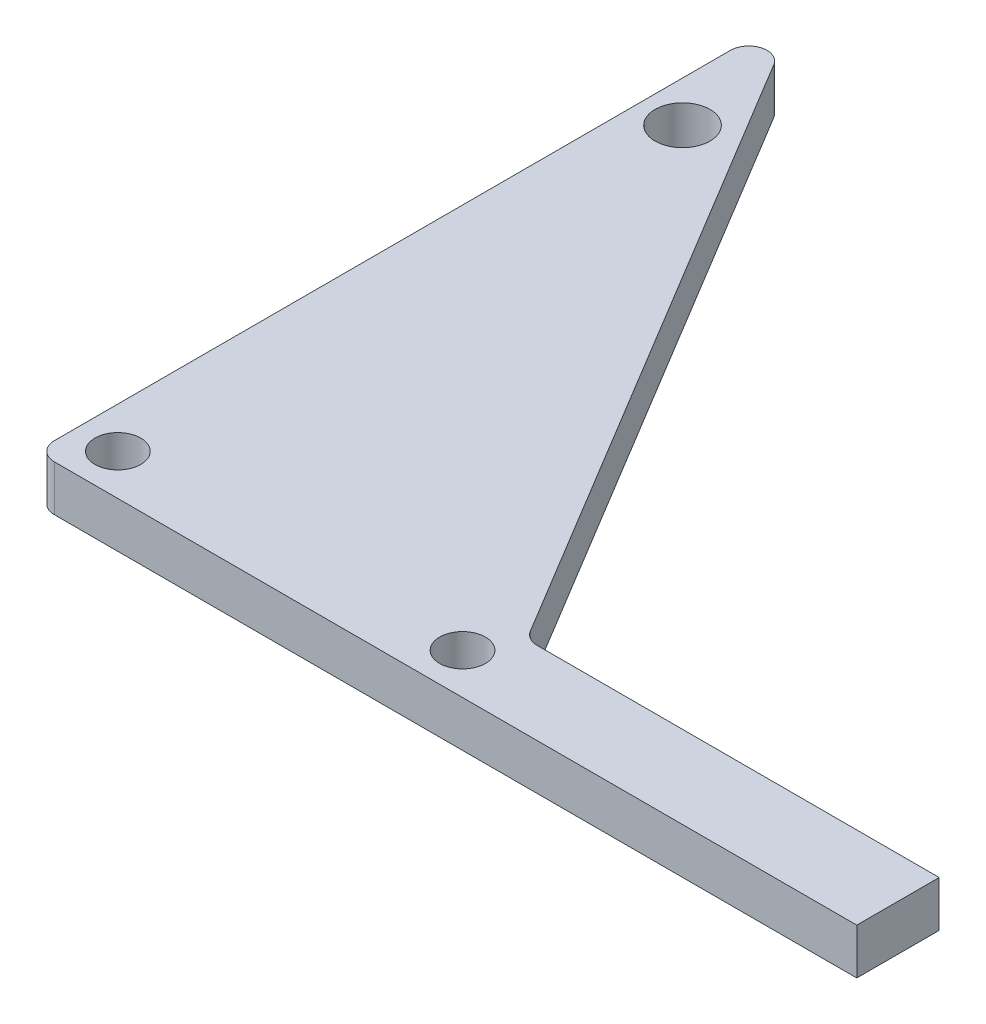
ISO-10303-21;
HEADER;
FILE_DESCRIPTION(('STEP AP214'),'2;1');
FILE_NAME('part.step','',(''),(''),'','','');
FILE_SCHEMA(('AUTOMOTIVE_DESIGN { 1 0 10303 214 1 1 1 1 }'));
ENDSEC;
DATA;
#1=APPLICATION_CONTEXT('core data for automotive mechanical design processes');
#2=APPLICATION_PROTOCOL_DEFINITION('international standard','automotive_design',2000,#1);
#3=PRODUCT_CONTEXT('',#1,'mechanical');
#4=PRODUCT('Part','Part','',(#3));
#5=PRODUCT_RELATED_PRODUCT_CATEGORY('part','',(#4));
#6=PRODUCT_DEFINITION_FORMATION('','',#4);
#7=PRODUCT_DEFINITION_CONTEXT('part definition',#1,'design');
#8=PRODUCT_DEFINITION('design','',#6,#7);
#9=PRODUCT_DEFINITION_SHAPE('','',#8);
#10=(LENGTH_UNIT() NAMED_UNIT(*) SI_UNIT(.MILLI.,.METRE.));
#11=(NAMED_UNIT(*) PLANE_ANGLE_UNIT() SI_UNIT($,.RADIAN.));
#12=(NAMED_UNIT(*) SI_UNIT($,.STERADIAN.) SOLID_ANGLE_UNIT());
#13=UNCERTAINTY_MEASURE_WITH_UNIT(LENGTH_MEASURE(1.E-05),#10,'distance_accuracy_value','');
#14=(GEOMETRIC_REPRESENTATION_CONTEXT(3) GLOBAL_UNCERTAINTY_ASSIGNED_CONTEXT((#13)) GLOBAL_UNIT_ASSIGNED_CONTEXT((#10,
#11,#12)) REPRESENTATION_CONTEXT('',''));
#15=CARTESIAN_POINT('',(0.,0.,0.));
#16=DIRECTION('',(0.,0.,1.));
#17=DIRECTION('',(1.,0.,0.));
#18=AXIS2_PLACEMENT_3D('',#15,#16,#17);
#19=CARTESIAN_POINT('',(0.,6.35,-105.41));
#20=DIRECTION('',(-0.856580972099991,0.,0.516012633795175));
#21=DIRECTION('',(0.516012633795176,0.,0.856580972099991));
#22=AXIS2_PLACEMENT_3D('',#19,#20,#21);
#23=PLANE('',#22);
#24=DIRECTION('',(-0.516012633795176,0.,-0.856580972099991));
#25=VECTOR('',#24,1.);
#26=CARTESIAN_POINT('',(0.,6.35,-105.41));
#27=LINE('',#26,#25);
#28=CARTESIAN_POINT('',(55.8738988493011,6.35,-12.6593279101602));
#29=VERTEX_POINT('',#28);
#30=CARTESIAN_POINT('',(4.71571566913398,6.35,-97.5819119892376));
#31=VERTEX_POINT('',#30);
#32=EDGE_CURVE('E148',#29,#31,#27,.T.);
#33=ORIENTED_EDGE('',*,*,#32,.F.);
#34=DIRECTION('',(0.,-1.,0.));
#35=VECTOR('',#34,1.);
#36=CARTESIAN_POINT('',(55.873898849301,0.,-12.6593279101603));
#37=LINE('',#36,#35);
#38=CARTESIAN_POINT('',(55.8738988493011,0.,-12.6593279101602));
#39=VERTEX_POINT('',#38);
#40=EDGE_CURVE('E175',#29,#39,#37,.T.);
#41=ORIENTED_EDGE('',*,*,#40,.T.);
#42=DIRECTION('',(-0.516012633795176,0.,-0.856580972099991));
#43=VECTOR('',#42,1.);
#44=CARTESIAN_POINT('',(0.,0.,-105.41));
#45=LINE('',#44,#43);
#46=CARTESIAN_POINT('',(4.71571566913398,0.,-97.5819119892376));
#47=VERTEX_POINT('',#46);
#48=EDGE_CURVE('E107',#39,#47,#45,.T.);
#49=ORIENTED_EDGE('',*,*,#48,.T.);
#50=DIRECTION('',(0.,-1.,0.));
#51=VECTOR('',#50,1.);
#52=CARTESIAN_POINT('',(4.71571566913398,6.35,-97.5819119892376));
#53=LINE('',#52,#51);
#54=EDGE_CURVE('E172',#47,#31,#53,.F.);
#55=ORIENTED_EDGE('',*,*,#54,.T.);
#56=EDGE_LOOP('',(#33,#41,#49,#55));
#57=FACE_BOUND('',#56,.T.);
#58=ADVANCED_FACE('F33',(#57),#23,.F.);
#59=CARTESIAN_POINT('',(63.5,6.35,0.));
#60=DIRECTION('',(0.,0.,-1.));
#61=DIRECTION('',(-1.,0.,0.));
#62=AXIS2_PLACEMENT_3D('',#59,#60,#61);
#63=PLANE('',#62);
#64=DIRECTION('',(0.,-1.,0.));
#65=VECTOR('',#64,1.);
#66=CARTESIAN_POINT('',(113.792,6.35,0.));
#67=LINE('',#66,#65);
#68=CARTESIAN_POINT('',(113.792,6.35,0.));
#69=VERTEX_POINT('',#68);
#70=CARTESIAN_POINT('',(113.792,0.,0.));
#71=VERTEX_POINT('',#70);
#72=EDGE_CURVE('E104',#69,#71,#67,.T.);
#73=ORIENTED_EDGE('',*,*,#72,.F.);
#74=DIRECTION('',(1.,0.,0.));
#75=VECTOR('',#74,1.);
#76=CARTESIAN_POINT('',(63.5,6.35,0.));
#77=LINE('',#76,#75);
#78=CARTESIAN_POINT('',(2.54,6.35,0.));
#79=VERTEX_POINT('',#78);
#80=EDGE_CURVE('E146',#79,#69,#77,.T.);
#81=ORIENTED_EDGE('',*,*,#80,.F.);
#82=DIRECTION('',(0.,-1.,0.));
#83=VECTOR('',#82,1.);
#84=CARTESIAN_POINT('',(2.54,6.35,0.));
#85=LINE('',#84,#83);
#86=CARTESIAN_POINT('',(2.54,0.,0.));
#87=VERTEX_POINT('',#86);
#88=EDGE_CURVE('E106',#79,#87,#85,.T.);
#89=ORIENTED_EDGE('',*,*,#88,.T.);
#90=DIRECTION('',(1.,0.,0.));
#91=VECTOR('',#90,1.);
#92=CARTESIAN_POINT('',(63.5,0.,0.));
#93=LINE('',#92,#91);
#94=EDGE_CURVE('E99',#87,#71,#93,.T.);
#95=ORIENTED_EDGE('',*,*,#94,.T.);
#96=EDGE_LOOP('',(#73,#81,#89,#95));
#97=FACE_BOUND('',#96,.T.);
#98=ADVANCED_FACE('F101',(#97),#63,.F.);
#99=CARTESIAN_POINT('',(0.,6.35,0.));
#100=DIRECTION('',(1.,0.,0.));
#101=DIRECTION('',(0.,0.,-1.));
#102=AXIS2_PLACEMENT_3D('',#99,#100,#101);
#103=PLANE('',#102);
#104=DIRECTION('',(0.,0.,1.));
#105=VECTOR('',#104,1.);
#106=CARTESIAN_POINT('',(0.,0.,0.));
#107=LINE('',#106,#105);
#108=CARTESIAN_POINT('',(0.,0.,-96.2712398993978));
#109=VERTEX_POINT('',#108);
#110=CARTESIAN_POINT('',(0.,0.,-2.54));
#111=VERTEX_POINT('',#110);
#112=EDGE_CURVE('E149',#109,#111,#107,.T.);
#113=ORIENTED_EDGE('',*,*,#112,.T.);
#114=DIRECTION('',(0.,-1.,0.));
#115=VECTOR('',#114,1.);
#116=CARTESIAN_POINT('',(0.,6.35,-2.54));
#117=LINE('',#116,#115);
#118=CARTESIAN_POINT('',(0.,6.35,-2.54));
#119=VERTEX_POINT('',#118);
#120=EDGE_CURVE('E166',#111,#119,#117,.F.);
#121=ORIENTED_EDGE('',*,*,#120,.T.);
#122=DIRECTION('',(0.,0.,1.));
#123=VECTOR('',#122,1.);
#124=CARTESIAN_POINT('',(0.,6.35,0.));
#125=LINE('',#124,#123);
#126=CARTESIAN_POINT('',(0.,6.35,-96.2712398993978));
#127=VERTEX_POINT('',#126);
#128=EDGE_CURVE('E151',#127,#119,#125,.T.);
#129=ORIENTED_EDGE('',*,*,#128,.F.);
#130=DIRECTION('',(0.,-1.,0.));
#131=VECTOR('',#130,1.);
#132=CARTESIAN_POINT('',(0.,6.35,-96.2712398993978));
#133=LINE('',#132,#131);
#134=EDGE_CURVE('E163',#127,#109,#133,.T.);
#135=ORIENTED_EDGE('',*,*,#134,.T.);
#136=EDGE_LOOP('',(#113,#121,#129,#135));
#137=FACE_BOUND('',#136,.T.);
#138=ADVANCED_FACE('F195',(#137),#103,.F.);
#139=CARTESIAN_POINT('',(0.,6.35,0.));
#140=DIRECTION('',(0.,-1.,0.));
#141=DIRECTION('',(0.,0.,-1.));
#142=AXIS2_PLACEMENT_3D('',#139,#140,#141);
#143=PLANE('',#142);
#144=DIRECTION('',(-1.,0.,0.));
#145=VECTOR('',#144,1.);
#146=CARTESIAN_POINT('',(113.792,6.35,-11.43));
#147=LINE('',#146,#145);
#148=CARTESIAN_POINT('',(113.792,6.35,-11.43));
#149=VERTEX_POINT('',#148);
#150=CARTESIAN_POINT('',(58.049614518435,6.35,-11.43));
#151=VERTEX_POINT('',#150);
#152=EDGE_CURVE('E126',#149,#151,#147,.T.);
#153=ORIENTED_EDGE('',*,*,#152,.T.);
#154=CARTESIAN_POINT('',(58.049614518435,6.35,-13.97));
#155=DIRECTION('',(0.,-1.,0.));
#156=DIRECTION('',(0.,0.,-1.));
#157=AXIS2_PLACEMENT_3D('',#154,#155,#156);
#158=CIRCLE('',#157,2.54);
#159=EDGE_CURVE('E11',#151,#29,#158,.T.);
#160=ORIENTED_EDGE('',*,*,#159,.T.);
#161=ORIENTED_EDGE('',*,*,#32,.T.);
#162=CARTESIAN_POINT('',(2.54,6.35,-96.2712398993978));
#163=DIRECTION('',(0.,-1.,0.));
#164=DIRECTION('',(0.,0.,-1.));
#165=AXIS2_PLACEMENT_3D('',#162,#163,#164);
#166=CIRCLE('',#165,2.54);
#167=EDGE_CURVE('E168',#31,#127,#166,.F.);
#168=ORIENTED_EDGE('',*,*,#167,.T.);
#169=ORIENTED_EDGE('',*,*,#128,.T.);
#170=CARTESIAN_POINT('',(2.54,6.35,-2.54));
#171=DIRECTION('',(0.,-1.,0.));
#172=DIRECTION('',(0.,0.,-1.));
#173=AXIS2_PLACEMENT_3D('',#170,#171,#172);
#174=CIRCLE('',#173,2.54);
#175=EDGE_CURVE('E170',#119,#79,#174,.F.);
#176=ORIENTED_EDGE('',*,*,#175,.T.);
#177=ORIENTED_EDGE('',*,*,#80,.T.);
#178=DIRECTION('',(0.,0.,1.));
#179=VECTOR('',#178,1.);
#180=CARTESIAN_POINT('',(113.792,6.35,0.));
#181=LINE('',#180,#179);
#182=EDGE_CURVE('E121',#149,#69,#181,.T.);
#183=ORIENTED_EDGE('',*,*,#182,.F.);
#184=EDGE_LOOP('',(#153,#160,#161,#168,#169,#176,#177,#183));
#185=FACE_BOUND('',#184,.T.);
#186=CARTESIAN_POINT('',(53.4606872138509,6.35,-5.67299462965267));
#187=DIRECTION('',(0.,1.,0.));
#188=DIRECTION('',(0.,0.,1.));
#189=AXIS2_PLACEMENT_3D('',#186,#187,#188);
#190=CIRCLE('',#189,3.175);
#191=CARTESIAN_POINT('',(53.4606872138509,6.35,-2.49799462965267));
#192=VERTEX_POINT('',#191);
#193=EDGE_CURVE('E129',#192,#192,#190,.T.);
#194=ORIENTED_EDGE('',*,*,#193,.F.);
#195=EDGE_LOOP('',(#194));
#196=FACE_BOUND('',#195,.T.);
#197=CARTESIAN_POINT('',(5.67299462965267,6.35,-5.67299462965267));
#198=DIRECTION('',(0.,1.,0.));
#199=DIRECTION('',(0.,0.,1.));
#200=AXIS2_PLACEMENT_3D('',#197,#198,#199);
#201=CIRCLE('',#200,3.175);
#202=CARTESIAN_POINT('',(5.67299462965267,6.35,-2.49799462965267));
#203=VERTEX_POINT('',#202);
#204=EDGE_CURVE('E138',#203,#203,#201,.T.);
#205=ORIENTED_EDGE('',*,*,#204,.F.);
#206=EDGE_LOOP('',(#205));
#207=FACE_BOUND('',#206,.T.);
#208=CARTESIAN_POINT('',(5.67299462965266,6.35,-83.9637484957621));
#209=DIRECTION('',(0.,1.,0.));
#210=DIRECTION('',(0.,0.,1.));
#211=AXIS2_PLACEMENT_3D('',#208,#209,#210);
#212=CIRCLE('',#211,3.81);
#213=CARTESIAN_POINT('',(5.67299462965266,6.35,-80.1537484957621));
#214=VERTEX_POINT('',#213);
#215=EDGE_CURVE('E132',#214,#214,#212,.T.);
#216=ORIENTED_EDGE('',*,*,#215,.F.);
#217=EDGE_LOOP('',(#216));
#218=FACE_BOUND('',#217,.T.);
#219=ADVANCED_FACE('F191',(#185,#196,#207,#218),#143,.F.);
#220=CARTESIAN_POINT('',(0.,0.,0.));
#221=DIRECTION('',(0.,-1.,0.));
#222=DIRECTION('',(0.,0.,-1.));
#223=AXIS2_PLACEMENT_3D('',#220,#221,#222);
#224=PLANE('',#223);
#225=ORIENTED_EDGE('',*,*,#48,.F.);
#226=CARTESIAN_POINT('',(58.049614518435,0.,-13.97));
#227=DIRECTION('',(0.,-1.,0.));
#228=DIRECTION('',(0.,0.,-1.));
#229=AXIS2_PLACEMENT_3D('',#226,#227,#228);
#230=CIRCLE('',#229,2.54);
#231=CARTESIAN_POINT('',(58.049614518435,0.,-11.43));
#232=VERTEX_POINT('',#231);
#233=EDGE_CURVE('E41',#39,#232,#230,.F.);
#234=ORIENTED_EDGE('',*,*,#233,.T.);
#235=DIRECTION('',(-1.,0.,0.));
#236=VECTOR('',#235,1.);
#237=CARTESIAN_POINT('',(113.792,0.,-11.43));
#238=LINE('',#237,#236);
#239=CARTESIAN_POINT('',(113.792,0.,-11.43));
#240=VERTEX_POINT('',#239);
#241=EDGE_CURVE('E113',#240,#232,#238,.T.);
#242=ORIENTED_EDGE('',*,*,#241,.F.);
#243=DIRECTION('',(0.,0.,-1.));
#244=VECTOR('',#243,1.);
#245=CARTESIAN_POINT('',(113.792,0.,0.));
#246=LINE('',#245,#244);
#247=EDGE_CURVE('E110',#71,#240,#246,.T.);
#248=ORIENTED_EDGE('',*,*,#247,.F.);
#249=ORIENTED_EDGE('',*,*,#94,.F.);
#250=CARTESIAN_POINT('',(2.54,0.,-2.54));
#251=DIRECTION('',(0.,-1.,0.));
#252=DIRECTION('',(0.,0.,-1.));
#253=AXIS2_PLACEMENT_3D('',#250,#251,#252);
#254=CIRCLE('',#253,2.54);
#255=EDGE_CURVE('E161',#87,#111,#254,.T.);
#256=ORIENTED_EDGE('',*,*,#255,.T.);
#257=ORIENTED_EDGE('',*,*,#112,.F.);
#258=CARTESIAN_POINT('',(2.54,0.,-96.2712398993978));
#259=DIRECTION('',(0.,-1.,0.));
#260=DIRECTION('',(0.,0.,-1.));
#261=AXIS2_PLACEMENT_3D('',#258,#259,#260);
#262=CIRCLE('',#261,2.54);
#263=EDGE_CURVE('E158',#109,#47,#262,.T.);
#264=ORIENTED_EDGE('',*,*,#263,.T.);
#265=EDGE_LOOP('',(#225,#234,#242,#248,#249,#256,#257,#264));
#266=FACE_BOUND('',#265,.T.);
#267=CARTESIAN_POINT('',(5.67299462965266,0.,-83.9637484957621));
#268=DIRECTION('',(0.,1.,0.));
#269=DIRECTION('',(0.,0.,1.));
#270=AXIS2_PLACEMENT_3D('',#267,#268,#269);
#271=CIRCLE('',#270,3.81);
#272=CARTESIAN_POINT('',(5.67299462965266,0.,-80.1537484957621));
#273=VERTEX_POINT('',#272);
#274=EDGE_CURVE('E108',#273,#273,#271,.T.);
#275=ORIENTED_EDGE('',*,*,#274,.T.);
#276=EDGE_LOOP('',(#275));
#277=FACE_BOUND('',#276,.T.);
#278=CARTESIAN_POINT('',(5.67299462965267,0.,-5.67299462965267));
#279=DIRECTION('',(0.,1.,0.));
#280=DIRECTION('',(0.,0.,1.));
#281=AXIS2_PLACEMENT_3D('',#278,#279,#280);
#282=CIRCLE('',#281,3.175);
#283=CARTESIAN_POINT('',(5.67299462965267,0.,-2.49799462965267));
#284=VERTEX_POINT('',#283);
#285=EDGE_CURVE('E135',#284,#284,#282,.T.);
#286=ORIENTED_EDGE('',*,*,#285,.T.);
#287=EDGE_LOOP('',(#286));
#288=FACE_BOUND('',#287,.T.);
#289=CARTESIAN_POINT('',(53.4606872138509,0.,-5.67299462965267));
#290=DIRECTION('',(0.,1.,0.));
#291=DIRECTION('',(0.,0.,1.));
#292=AXIS2_PLACEMENT_3D('',#289,#290,#291);
#293=CIRCLE('',#292,3.175);
#294=CARTESIAN_POINT('',(53.4606872138509,0.,-2.49799462965267));
#295=VERTEX_POINT('',#294);
#296=EDGE_CURVE('E141',#295,#295,#293,.T.);
#297=ORIENTED_EDGE('',*,*,#296,.T.);
#298=EDGE_LOOP('',(#297));
#299=FACE_BOUND('',#298,.T.);
#300=ADVANCED_FACE('F111',(#266,#277,#288,#299),#224,.T.);
#301=CARTESIAN_POINT('',(2.54,6.35,-2.54));
#302=DIRECTION('',(0.,-1.,0.));
#303=DIRECTION('',(0.,0.,-1.));
#304=AXIS2_PLACEMENT_3D('',#301,#302,#303);
#305=CYLINDRICAL_SURFACE('',#304,2.54);
#306=ORIENTED_EDGE('',*,*,#175,.F.);
#307=ORIENTED_EDGE('',*,*,#120,.F.);
#308=ORIENTED_EDGE('',*,*,#255,.F.);
#309=ORIENTED_EDGE('',*,*,#88,.F.);
#310=EDGE_LOOP('',(#306,#307,#308,#309));
#311=FACE_BOUND('',#310,.T.);
#312=ADVANCED_FACE('F198',(#311),#305,.T.);
#313=CARTESIAN_POINT('',(2.54,6.35,-96.2712398993978));
#314=DIRECTION('',(0.,-1.,0.));
#315=DIRECTION('',(0.,0.,-1.));
#316=AXIS2_PLACEMENT_3D('',#313,#314,#315);
#317=CYLINDRICAL_SURFACE('',#316,2.54);
#318=ORIENTED_EDGE('',*,*,#167,.F.);
#319=ORIENTED_EDGE('',*,*,#54,.F.);
#320=ORIENTED_EDGE('',*,*,#263,.F.);
#321=ORIENTED_EDGE('',*,*,#134,.F.);
#322=EDGE_LOOP('',(#318,#319,#320,#321));
#323=FACE_BOUND('',#322,.T.);
#324=ADVANCED_FACE('F188',(#323),#317,.T.);
#325=CARTESIAN_POINT('',(53.4606872138509,0.,-5.67299462965267));
#326=DIRECTION('',(0.,1.,0.));
#327=DIRECTION('',(0.,0.,1.));
#328=AXIS2_PLACEMENT_3D('',#325,#326,#327);
#329=CYLINDRICAL_SURFACE('',#328,3.175);
#330=ORIENTED_EDGE('',*,*,#296,.F.);
#331=EDGE_LOOP('',(#330));
#332=FACE_BOUND('',#331,.T.);
#333=ORIENTED_EDGE('',*,*,#193,.T.);
#334=EDGE_LOOP('',(#333));
#335=FACE_BOUND('',#334,.T.);
#336=ADVANCED_FACE('F218',(#332,#335),#329,.F.);
#337=CARTESIAN_POINT('',(5.67299462965267,0.,-5.67299462965267));
#338=DIRECTION('',(0.,1.,0.));
#339=DIRECTION('',(0.,0.,1.));
#340=AXIS2_PLACEMENT_3D('',#337,#338,#339);
#341=CYLINDRICAL_SURFACE('',#340,3.175);
#342=ORIENTED_EDGE('',*,*,#285,.F.);
#343=EDGE_LOOP('',(#342));
#344=FACE_BOUND('',#343,.T.);
#345=ORIENTED_EDGE('',*,*,#204,.T.);
#346=EDGE_LOOP('',(#345));
#347=FACE_BOUND('',#346,.T.);
#348=ADVANCED_FACE('F222',(#344,#347),#341,.F.);
#349=CARTESIAN_POINT('',(5.67299462965266,0.,-83.9637484957621));
#350=DIRECTION('',(0.,1.,0.));
#351=DIRECTION('',(0.,0.,1.));
#352=AXIS2_PLACEMENT_3D('',#349,#350,#351);
#353=CYLINDRICAL_SURFACE('',#352,3.81);
#354=ORIENTED_EDGE('',*,*,#274,.F.);
#355=EDGE_LOOP('',(#354));
#356=FACE_BOUND('',#355,.T.);
#357=ORIENTED_EDGE('',*,*,#215,.T.);
#358=EDGE_LOOP('',(#357));
#359=FACE_BOUND('',#358,.T.);
#360=ADVANCED_FACE('F228',(#356,#359),#353,.F.);
#361=CARTESIAN_POINT('',(113.792,6.35,-11.43));
#362=DIRECTION('',(0.,0.,1.));
#363=DIRECTION('',(0.,-1.,0.));
#364=AXIS2_PLACEMENT_3D('',#361,#362,#363);
#365=PLANE('',#364);
#366=ORIENTED_EDGE('',*,*,#241,.T.);
#367=DIRECTION('',(0.,-1.,0.));
#368=VECTOR('',#367,1.);
#369=CARTESIAN_POINT('',(58.049614518435,6.35,-11.43));
#370=LINE('',#369,#368);
#371=EDGE_CURVE('E48',#232,#151,#370,.F.);
#372=ORIENTED_EDGE('',*,*,#371,.T.);
#373=ORIENTED_EDGE('',*,*,#152,.F.);
#374=DIRECTION('',(0.,1.,0.));
#375=VECTOR('',#374,1.);
#376=CARTESIAN_POINT('',(113.792,6.35,-11.43));
#377=LINE('',#376,#375);
#378=EDGE_CURVE('E116',#240,#149,#377,.T.);
#379=ORIENTED_EDGE('',*,*,#378,.F.);
#380=EDGE_LOOP('',(#366,#372,#373,#379));
#381=FACE_BOUND('',#380,.T.);
#382=ADVANCED_FACE('F203',(#381),#365,.F.);
#383=CARTESIAN_POINT('',(113.792,0.,0.));
#384=DIRECTION('',(1.,0.,0.));
#385=DIRECTION('',(0.,0.,-1.));
#386=AXIS2_PLACEMENT_3D('',#383,#384,#385);
#387=PLANE('',#386);
#388=ORIENTED_EDGE('',*,*,#72,.T.);
#389=ORIENTED_EDGE('',*,*,#247,.T.);
#390=ORIENTED_EDGE('',*,*,#378,.T.);
#391=ORIENTED_EDGE('',*,*,#182,.T.);
#392=EDGE_LOOP('',(#388,#389,#390,#391));
#393=FACE_BOUND('',#392,.T.);
#394=ADVANCED_FACE('F119',(#393),#387,.T.);
#395=CARTESIAN_POINT('',(58.049614518435,6.34999999999997,-13.97));
#396=DIRECTION('',(0.,1.,0.));
#397=DIRECTION('',(0.,0.,1.));
#398=AXIS2_PLACEMENT_3D('',#395,#396,#397);
#399=CYLINDRICAL_SURFACE('',#398,2.54);
#400=ORIENTED_EDGE('',*,*,#159,.F.);
#401=ORIENTED_EDGE('',*,*,#371,.F.);
#402=ORIENTED_EDGE('',*,*,#233,.F.);
#403=ORIENTED_EDGE('',*,*,#40,.F.);
#404=EDGE_LOOP('',(#400,#401,#402,#403));
#405=FACE_BOUND('',#404,.T.);
#406=ADVANCED_FACE('F35',(#405),#399,.F.);
#407=CLOSED_SHELL('',(#58,#98,#138,#219,#300,#312,#324,#336,#348,#360,#382,#394,#406));
#408=MANIFOLD_SOLID_BREP('B2',#407);
#409=ADVANCED_BREP_SHAPE_REPRESENTATION('',(#18,#408),#14);
#410=SHAPE_DEFINITION_REPRESENTATION(#9,#409);
ENDSEC;
END-ISO-10303-21;
